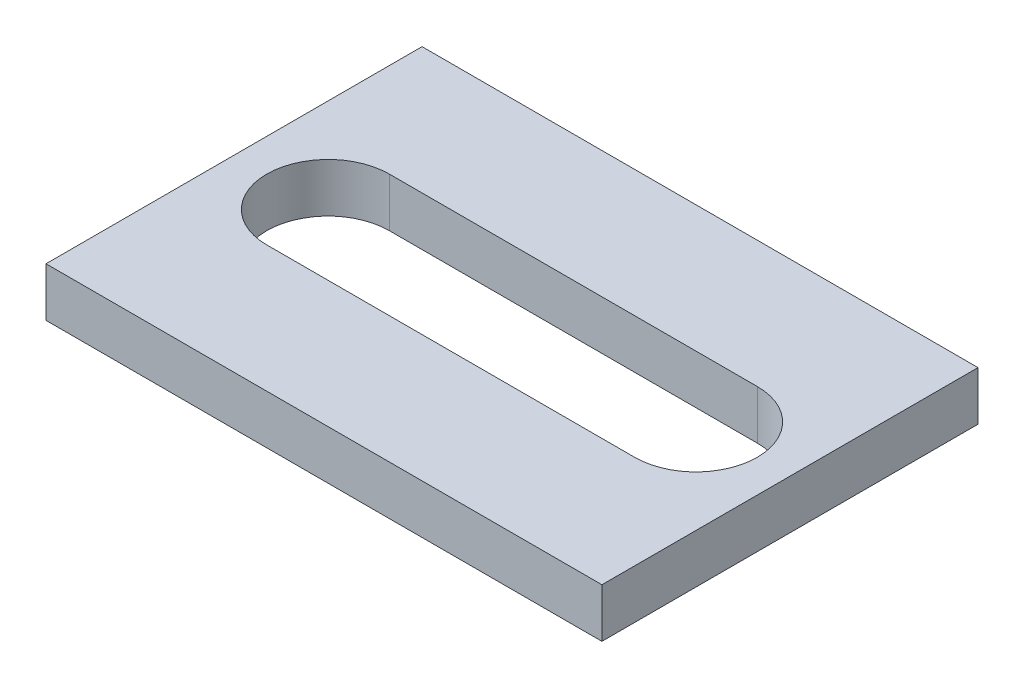
ISO-10303-21;
HEADER;
FILE_DESCRIPTION(('STEP AP214'),'2;1');
FILE_NAME('part.step','',(''),(''),'','','');
FILE_SCHEMA(('AUTOMOTIVE_DESIGN { 1 0 10303 214 1 1 1 1 }'));
ENDSEC;
DATA;
#1=APPLICATION_CONTEXT('core data for automotive mechanical design processes');
#2=APPLICATION_PROTOCOL_DEFINITION('international standard','automotive_design',2000,#1);
#3=PRODUCT_CONTEXT('',#1,'mechanical');
#4=PRODUCT('Part','Part','',(#3));
#5=PRODUCT_RELATED_PRODUCT_CATEGORY('part','',(#4));
#6=PRODUCT_DEFINITION_FORMATION('','',#4);
#7=PRODUCT_DEFINITION_CONTEXT('part definition',#1,'design');
#8=PRODUCT_DEFINITION('design','',#6,#7);
#9=PRODUCT_DEFINITION_SHAPE('','',#8);
#10=(LENGTH_UNIT() NAMED_UNIT(*) SI_UNIT(.MILLI.,.METRE.));
#11=(NAMED_UNIT(*) PLANE_ANGLE_UNIT() SI_UNIT($,.RADIAN.));
#12=(NAMED_UNIT(*) SI_UNIT($,.STERADIAN.) SOLID_ANGLE_UNIT());
#13=UNCERTAINTY_MEASURE_WITH_UNIT(LENGTH_MEASURE(1.E-05),#10,'distance_accuracy_value','');
#14=(GEOMETRIC_REPRESENTATION_CONTEXT(3) GLOBAL_UNCERTAINTY_ASSIGNED_CONTEXT((#13)) GLOBAL_UNIT_ASSIGNED_CONTEXT((#10,
#11,#12)) REPRESENTATION_CONTEXT('',''));
#15=CARTESIAN_POINT('',(0.,0.,0.));
#16=DIRECTION('',(0.,0.,1.));
#17=DIRECTION('',(1.,0.,0.));
#18=AXIS2_PLACEMENT_3D('',#15,#16,#17);
#19=CARTESIAN_POINT('',(0.,12.,0.));
#20=DIRECTION('',(0.,-1.,0.));
#21=DIRECTION('',(0.,0.,-1.));
#22=AXIS2_PLACEMENT_3D('',#19,#20,#21);
#23=PLANE('',#22);
#24=DIRECTION('',(0.,0.,-1.));
#25=VECTOR('',#24,1.);
#26=CARTESIAN_POINT('',(0.,12.,0.));
#27=LINE('',#26,#25);
#28=CARTESIAN_POINT('',(0.,12.,0.));
#29=VERTEX_POINT('',#28);
#30=CARTESIAN_POINT('',(0.,12.,-92.));
#31=VERTEX_POINT('',#30);
#32=EDGE_CURVE('E128',#29,#31,#27,.T.);
#33=ORIENTED_EDGE('',*,*,#32,.F.);
#34=DIRECTION('',(1.,0.,0.));
#35=VECTOR('',#34,1.);
#36=CARTESIAN_POINT('',(0.,12.,0.));
#37=LINE('',#36,#35);
#38=CARTESIAN_POINT('',(136.,12.,0.));
#39=VERTEX_POINT('',#38);
#40=EDGE_CURVE('E137',#29,#39,#37,.T.);
#41=ORIENTED_EDGE('',*,*,#40,.T.);
#42=DIRECTION('',(0.,0.,-1.));
#43=VECTOR('',#42,1.);
#44=CARTESIAN_POINT('',(136.,12.,0.));
#45=LINE('',#44,#43);
#46=CARTESIAN_POINT('',(136.,12.,-92.));
#47=VERTEX_POINT('',#46);
#48=EDGE_CURVE('E135',#39,#47,#45,.T.);
#49=ORIENTED_EDGE('',*,*,#48,.T.);
#50=DIRECTION('',(1.,0.,0.));
#51=VECTOR('',#50,1.);
#52=CARTESIAN_POINT('',(0.,12.,-92.));
#53=LINE('',#52,#51);
#54=EDGE_CURVE('E131',#31,#47,#53,.T.);
#55=ORIENTED_EDGE('',*,*,#54,.F.);
#56=EDGE_LOOP('',(#33,#41,#49,#55));
#57=FACE_BOUND('',#56,.T.);
#58=CARTESIAN_POINT('',(113.,12.,-46.));
#59=DIRECTION('',(0.,-1.,0.));
#60=DIRECTION('',(0.,0.,-1.));
#61=AXIS2_PLACEMENT_3D('',#58,#59,#60);
#62=CIRCLE('',#61,15.);
#63=CARTESIAN_POINT('',(113.,12.,-61.));
#64=VERTEX_POINT('',#63);
#65=CARTESIAN_POINT('',(113.,12.,-31.));
#66=VERTEX_POINT('',#65);
#67=EDGE_CURVE('E104',#64,#66,#62,.T.);
#68=ORIENTED_EDGE('',*,*,#67,.T.);
#69=DIRECTION('',(-1.,0.,0.));
#70=VECTOR('',#69,1.);
#71=CARTESIAN_POINT('',(23.,12.,-31.));
#72=LINE('',#71,#70);
#73=CARTESIAN_POINT('',(23.,12.,-31.));
#74=VERTEX_POINT('',#73);
#75=EDGE_CURVE('E127',#66,#74,#72,.T.);
#76=ORIENTED_EDGE('',*,*,#75,.T.);
#77=CARTESIAN_POINT('',(23.,12.,-46.));
#78=DIRECTION('',(0.,-1.,0.));
#79=DIRECTION('',(0.,0.,-1.));
#80=AXIS2_PLACEMENT_3D('',#77,#78,#79);
#81=CIRCLE('',#80,15.);
#82=CARTESIAN_POINT('',(23.,12.,-61.));
#83=VERTEX_POINT('',#82);
#84=EDGE_CURVE('E176',#74,#83,#81,.T.);
#85=ORIENTED_EDGE('',*,*,#84,.T.);
#86=DIRECTION('',(-1.,0.,0.));
#87=VECTOR('',#86,1.);
#88=CARTESIAN_POINT('',(23.,12.,-61.));
#89=LINE('',#88,#87);
#90=EDGE_CURVE('E143',#64,#83,#89,.T.);
#91=ORIENTED_EDGE('',*,*,#90,.F.);
#92=EDGE_LOOP('',(#68,#76,#85,#91));
#93=FACE_BOUND('',#92,.T.);
#94=ADVANCED_FACE('F32',(#57,#93),#23,.F.);
#95=CARTESIAN_POINT('',(0.,0.,0.));
#96=DIRECTION('',(0.,-1.,0.));
#97=DIRECTION('',(0.,0.,-1.));
#98=AXIS2_PLACEMENT_3D('',#95,#96,#97);
#99=PLANE('',#98);
#100=DIRECTION('',(0.,0.,-1.));
#101=VECTOR('',#100,1.);
#102=CARTESIAN_POINT('',(0.,0.,0.));
#103=LINE('',#102,#101);
#104=CARTESIAN_POINT('',(0.,0.,0.));
#105=VERTEX_POINT('',#104);
#106=CARTESIAN_POINT('',(0.,0.,-92.));
#107=VERTEX_POINT('',#106);
#108=EDGE_CURVE('E139',#105,#107,#103,.T.);
#109=ORIENTED_EDGE('',*,*,#108,.T.);
#110=DIRECTION('',(1.,0.,0.));
#111=VECTOR('',#110,1.);
#112=CARTESIAN_POINT('',(0.,0.,-92.));
#113=LINE('',#112,#111);
#114=CARTESIAN_POINT('',(136.,0.,-92.));
#115=VERTEX_POINT('',#114);
#116=EDGE_CURVE('E142',#107,#115,#113,.T.);
#117=ORIENTED_EDGE('',*,*,#116,.T.);
#118=DIRECTION('',(0.,0.,-1.));
#119=VECTOR('',#118,1.);
#120=CARTESIAN_POINT('',(136.,0.,0.));
#121=LINE('',#120,#119);
#122=CARTESIAN_POINT('',(136.,0.,0.));
#123=VERTEX_POINT('',#122);
#124=EDGE_CURVE('E146',#123,#115,#121,.T.);
#125=ORIENTED_EDGE('',*,*,#124,.F.);
#126=DIRECTION('',(1.,0.,0.));
#127=VECTOR('',#126,1.);
#128=CARTESIAN_POINT('',(0.,0.,0.));
#129=LINE('',#128,#127);
#130=EDGE_CURVE('E132',#105,#123,#129,.T.);
#131=ORIENTED_EDGE('',*,*,#130,.F.);
#132=EDGE_LOOP('',(#109,#117,#125,#131));
#133=FACE_BOUND('',#132,.T.);
#134=DIRECTION('',(1.,0.,0.));
#135=VECTOR('',#134,1.);
#136=CARTESIAN_POINT('',(23.,0.,-31.));
#137=LINE('',#136,#135);
#138=CARTESIAN_POINT('',(23.,0.,-31.));
#139=VERTEX_POINT('',#138);
#140=CARTESIAN_POINT('',(113.,0.,-31.));
#141=VERTEX_POINT('',#140);
#142=EDGE_CURVE('E116',#139,#141,#137,.T.);
#143=ORIENTED_EDGE('',*,*,#142,.T.);
#144=CARTESIAN_POINT('',(113.,0.,-46.));
#145=DIRECTION('',(0.,1.,0.));
#146=DIRECTION('',(0.,0.,1.));
#147=AXIS2_PLACEMENT_3D('',#144,#145,#146);
#148=CIRCLE('',#147,15.);
#149=CARTESIAN_POINT('',(113.,0.,-61.));
#150=VERTEX_POINT('',#149);
#151=EDGE_CURVE('E101',#141,#150,#148,.T.);
#152=ORIENTED_EDGE('',*,*,#151,.T.);
#153=DIRECTION('',(1.,0.,0.));
#154=VECTOR('',#153,1.);
#155=CARTESIAN_POINT('',(23.,0.,-61.));
#156=LINE('',#155,#154);
#157=CARTESIAN_POINT('',(23.,0.,-61.));
#158=VERTEX_POINT('',#157);
#159=EDGE_CURVE('E109',#158,#150,#156,.T.);
#160=ORIENTED_EDGE('',*,*,#159,.F.);
#161=CARTESIAN_POINT('',(23.,0.,-46.));
#162=DIRECTION('',(0.,1.,0.));
#163=DIRECTION('',(0.,0.,1.));
#164=AXIS2_PLACEMENT_3D('',#161,#162,#163);
#165=CIRCLE('',#164,15.);
#166=EDGE_CURVE('E57',#158,#139,#165,.T.);
#167=ORIENTED_EDGE('',*,*,#166,.T.);
#168=EDGE_LOOP('',(#143,#152,#160,#167));
#169=FACE_BOUND('',#168,.T.);
#170=ADVANCED_FACE('F114',(#133,#169),#99,.T.);
#171=CARTESIAN_POINT('',(0.,12.,0.));
#172=DIRECTION('',(-1.,0.,0.));
#173=DIRECTION('',(0.,0.,1.));
#174=AXIS2_PLACEMENT_3D('',#171,#172,#173);
#175=PLANE('',#174);
#176=ORIENTED_EDGE('',*,*,#108,.F.);
#177=DIRECTION('',(0.,-1.,0.));
#178=VECTOR('',#177,1.);
#179=CARTESIAN_POINT('',(0.,12.,0.));
#180=LINE('',#179,#178);
#181=EDGE_CURVE('E11',#29,#105,#180,.T.);
#182=ORIENTED_EDGE('',*,*,#181,.F.);
#183=ORIENTED_EDGE('',*,*,#32,.T.);
#184=DIRECTION('',(0.,-1.,0.));
#185=VECTOR('',#184,1.);
#186=CARTESIAN_POINT('',(0.,12.,-92.));
#187=LINE('',#186,#185);
#188=EDGE_CURVE('E36',#31,#107,#187,.T.);
#189=ORIENTED_EDGE('',*,*,#188,.T.);
#190=EDGE_LOOP('',(#176,#182,#183,#189));
#191=FACE_BOUND('',#190,.T.);
#192=ADVANCED_FACE('F34',(#191),#175,.T.);
#193=CARTESIAN_POINT('',(0.,12.,0.));
#194=DIRECTION('',(0.,0.,-1.));
#195=DIRECTION('',(-1.,0.,0.));
#196=AXIS2_PLACEMENT_3D('',#193,#194,#195);
#197=PLANE('',#196);
#198=ORIENTED_EDGE('',*,*,#130,.T.);
#199=DIRECTION('',(0.,-1.,0.));
#200=VECTOR('',#199,1.);
#201=CARTESIAN_POINT('',(136.,12.,0.));
#202=LINE('',#201,#200);
#203=EDGE_CURVE('E41',#39,#123,#202,.T.);
#204=ORIENTED_EDGE('',*,*,#203,.F.);
#205=ORIENTED_EDGE('',*,*,#40,.F.);
#206=ORIENTED_EDGE('',*,*,#181,.T.);
#207=EDGE_LOOP('',(#198,#204,#205,#206));
#208=FACE_BOUND('',#207,.T.);
#209=ADVANCED_FACE('F165',(#208),#197,.F.);
#210=CARTESIAN_POINT('',(136.,12.,0.));
#211=DIRECTION('',(-1.,0.,0.));
#212=DIRECTION('',(0.,0.,1.));
#213=AXIS2_PLACEMENT_3D('',#210,#211,#212);
#214=PLANE('',#213);
#215=ORIENTED_EDGE('',*,*,#124,.T.);
#216=DIRECTION('',(0.,-1.,0.));
#217=VECTOR('',#216,1.);
#218=CARTESIAN_POINT('',(136.,12.,-92.));
#219=LINE('',#218,#217);
#220=EDGE_CURVE('E151',#47,#115,#219,.T.);
#221=ORIENTED_EDGE('',*,*,#220,.F.);
#222=ORIENTED_EDGE('',*,*,#48,.F.);
#223=ORIENTED_EDGE('',*,*,#203,.T.);
#224=EDGE_LOOP('',(#215,#221,#222,#223));
#225=FACE_BOUND('',#224,.T.);
#226=ADVANCED_FACE('F169',(#225),#214,.F.);
#227=CARTESIAN_POINT('',(0.,12.,-92.));
#228=DIRECTION('',(0.,0.,-1.));
#229=DIRECTION('',(-1.,0.,0.));
#230=AXIS2_PLACEMENT_3D('',#227,#228,#229);
#231=PLANE('',#230);
#232=ORIENTED_EDGE('',*,*,#116,.F.);
#233=ORIENTED_EDGE('',*,*,#188,.F.);
#234=ORIENTED_EDGE('',*,*,#54,.T.);
#235=ORIENTED_EDGE('',*,*,#220,.T.);
#236=EDGE_LOOP('',(#232,#233,#234,#235));
#237=FACE_BOUND('',#236,.T.);
#238=ADVANCED_FACE('F159',(#237),#231,.T.);
#239=CARTESIAN_POINT('',(113.,135.69316876853,-46.));
#240=DIRECTION('',(0.,-1.,0.));
#241=DIRECTION('',(0.,0.,-1.));
#242=AXIS2_PLACEMENT_3D('',#239,#240,#241);
#243=CYLINDRICAL_SURFACE('',#242,15.);
#244=DIRECTION('',(0.,-1.,0.));
#245=VECTOR('',#244,1.);
#246=CARTESIAN_POINT('',(113.,135.69316876853,-61.));
#247=LINE('',#246,#245);
#248=EDGE_CURVE('E49',#64,#150,#247,.T.);
#249=ORIENTED_EDGE('',*,*,#248,.T.);
#250=ORIENTED_EDGE('',*,*,#151,.F.);
#251=DIRECTION('',(0.,-1.,0.));
#252=VECTOR('',#251,1.);
#253=CARTESIAN_POINT('',(113.,135.69316876853,-31.));
#254=LINE('',#253,#252);
#255=EDGE_CURVE('E106',#66,#141,#254,.T.);
#256=ORIENTED_EDGE('',*,*,#255,.F.);
#257=ORIENTED_EDGE('',*,*,#67,.F.);
#258=EDGE_LOOP('',(#249,#250,#256,#257));
#259=FACE_BOUND('',#258,.T.);
#260=ADVANCED_FACE('F98',(#259),#243,.F.);
#261=CARTESIAN_POINT('',(23.,135.69316876853,-31.));
#262=DIRECTION('',(0.,0.,-1.));
#263=DIRECTION('',(-1.,0.,0.));
#264=AXIS2_PLACEMENT_3D('',#261,#262,#263);
#265=PLANE('',#264);
#266=ORIENTED_EDGE('',*,*,#255,.T.);
#267=ORIENTED_EDGE('',*,*,#142,.F.);
#268=DIRECTION('',(0.,-1.,0.));
#269=VECTOR('',#268,1.);
#270=CARTESIAN_POINT('',(23.,135.69316876853,-31.));
#271=LINE('',#270,#269);
#272=EDGE_CURVE('E123',#74,#139,#271,.T.);
#273=ORIENTED_EDGE('',*,*,#272,.F.);
#274=ORIENTED_EDGE('',*,*,#75,.F.);
#275=EDGE_LOOP('',(#266,#267,#273,#274));
#276=FACE_BOUND('',#275,.T.);
#277=ADVANCED_FACE('F182',(#276),#265,.T.);
#278=CARTESIAN_POINT('',(23.,135.69316876853,-46.));
#279=DIRECTION('',(0.,-1.,0.));
#280=DIRECTION('',(0.,0.,-1.));
#281=AXIS2_PLACEMENT_3D('',#278,#279,#280);
#282=CYLINDRICAL_SURFACE('',#281,15.);
#283=ORIENTED_EDGE('',*,*,#272,.T.);
#284=ORIENTED_EDGE('',*,*,#166,.F.);
#285=DIRECTION('',(0.,-1.,0.));
#286=VECTOR('',#285,1.);
#287=CARTESIAN_POINT('',(23.,135.69316876853,-61.));
#288=LINE('',#287,#286);
#289=EDGE_CURVE('E111',#83,#158,#288,.T.);
#290=ORIENTED_EDGE('',*,*,#289,.F.);
#291=ORIENTED_EDGE('',*,*,#84,.F.);
#292=EDGE_LOOP('',(#283,#284,#290,#291));
#293=FACE_BOUND('',#292,.T.);
#294=ADVANCED_FACE('F179',(#293),#282,.F.);
#295=CARTESIAN_POINT('',(23.,135.69316876853,-61.));
#296=DIRECTION('',(0.,0.,-1.));
#297=DIRECTION('',(-1.,0.,0.));
#298=AXIS2_PLACEMENT_3D('',#295,#296,#297);
#299=PLANE('',#298);
#300=ORIENTED_EDGE('',*,*,#90,.T.);
#301=ORIENTED_EDGE('',*,*,#289,.T.);
#302=ORIENTED_EDGE('',*,*,#159,.T.);
#303=ORIENTED_EDGE('',*,*,#248,.F.);
#304=EDGE_LOOP('',(#300,#301,#302,#303));
#305=FACE_BOUND('',#304,.T.);
#306=ADVANCED_FACE('F110',(#305),#299,.F.);
#307=CLOSED_SHELL('',(#94,#170,#192,#209,#226,#238,#260,#277,#294,#306));
#308=MANIFOLD_SOLID_BREP('B2',#307);
#309=ADVANCED_BREP_SHAPE_REPRESENTATION('',(#18,#308),#14);
#310=SHAPE_DEFINITION_REPRESENTATION(#9,#309);
ENDSEC;
END-ISO-10303-21;
